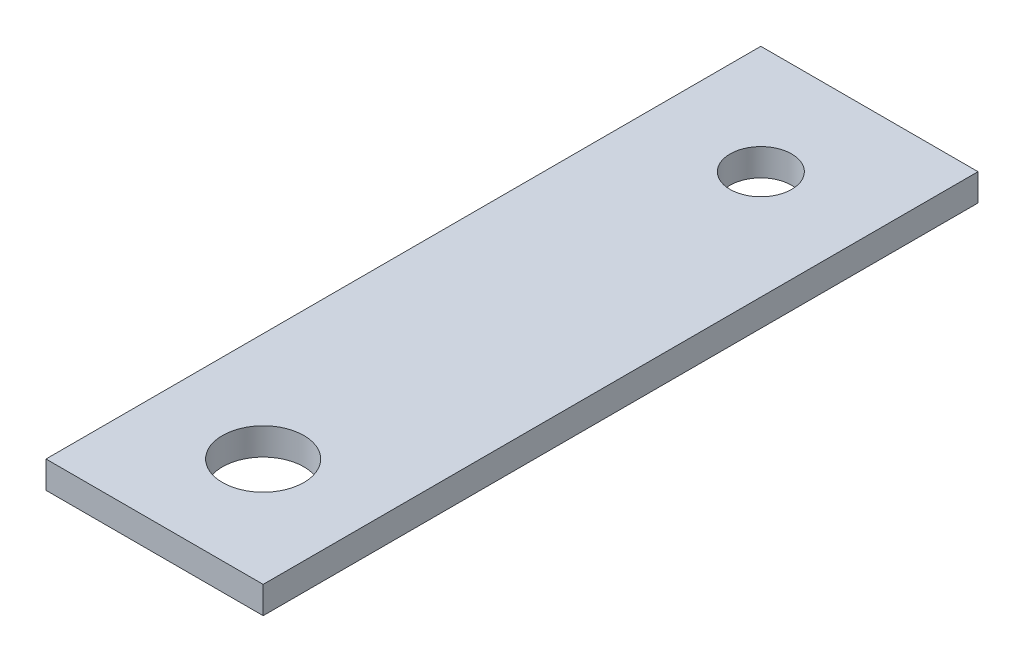
ISO-10303-21;
HEADER;
FILE_DESCRIPTION(('STEP AP214'),'2;1');
FILE_NAME('part.step','',(''),(''),'','','');
FILE_SCHEMA(('AUTOMOTIVE_DESIGN { 1 0 10303 214 1 1 1 1 }'));
ENDSEC;
DATA;
#1=APPLICATION_CONTEXT('core data for automotive mechanical design processes');
#2=APPLICATION_PROTOCOL_DEFINITION('international standard','automotive_design',2000,#1);
#3=PRODUCT_CONTEXT('',#1,'mechanical');
#4=PRODUCT('Part','Part','',(#3));
#5=PRODUCT_RELATED_PRODUCT_CATEGORY('part','',(#4));
#6=PRODUCT_DEFINITION_FORMATION('','',#4);
#7=PRODUCT_DEFINITION_CONTEXT('part definition',#1,'design');
#8=PRODUCT_DEFINITION('design','',#6,#7);
#9=PRODUCT_DEFINITION_SHAPE('','',#8);
#10=(LENGTH_UNIT() NAMED_UNIT(*) SI_UNIT(.MILLI.,.METRE.));
#11=(NAMED_UNIT(*) PLANE_ANGLE_UNIT() SI_UNIT($,.RADIAN.));
#12=(NAMED_UNIT(*) SI_UNIT($,.STERADIAN.) SOLID_ANGLE_UNIT());
#13=UNCERTAINTY_MEASURE_WITH_UNIT(LENGTH_MEASURE(1.E-05),#10,'distance_accuracy_value','');
#14=(GEOMETRIC_REPRESENTATION_CONTEXT(3) GLOBAL_UNCERTAINTY_ASSIGNED_CONTEXT((#13)) GLOBAL_UNIT_ASSIGNED_CONTEXT((#10,
#11,#12)) REPRESENTATION_CONTEXT('',''));
#15=CARTESIAN_POINT('',(0.,0.,0.));
#16=DIRECTION('',(0.,0.,1.));
#17=DIRECTION('',(1.,0.,0.));
#18=AXIS2_PLACEMENT_3D('',#15,#16,#17);
#19=CARTESIAN_POINT('',(-40.,-100.75,118.5));
#20=DIRECTION('',(0.,0.,1.));
#21=DIRECTION('',(1.,0.,0.));
#22=AXIS2_PLACEMENT_3D('',#19,#20,#21);
#23=PLANE('',#22);
#24=DIRECTION('',(-1.,0.,0.));
#25=VECTOR('',#24,1.);
#26=CARTESIAN_POINT('',(-40.,-101.5,118.5));
#27=LINE('',#26,#25);
#28=CARTESIAN_POINT('',(-34.,-101.5,118.5));
#29=VERTEX_POINT('',#28);
#30=CARTESIAN_POINT('',(-46.,-101.5,118.5));
#31=VERTEX_POINT('',#30);
#32=EDGE_CURVE('E10',#29,#31,#27,.T.);
#33=ORIENTED_EDGE('',*,*,#32,.F.);
#34=DIRECTION('',(0.,-1.,0.));
#35=VECTOR('',#34,1.);
#36=CARTESIAN_POINT('',(-34.,-100.75,118.5));
#37=LINE('',#36,#35);
#38=CARTESIAN_POINT('',(-34.,-100.,118.5));
#39=VERTEX_POINT('',#38);
#40=EDGE_CURVE('E62',#39,#29,#37,.T.);
#41=ORIENTED_EDGE('',*,*,#40,.F.);
#42=DIRECTION('',(1.,0.,0.));
#43=VECTOR('',#42,1.);
#44=CARTESIAN_POINT('',(-40.,-100.,118.5));
#45=LINE('',#44,#43);
#46=CARTESIAN_POINT('',(-46.,-100.,118.5));
#47=VERTEX_POINT('',#46);
#48=EDGE_CURVE('E90',#47,#39,#45,.T.);
#49=ORIENTED_EDGE('',*,*,#48,.F.);
#50=DIRECTION('',(0.,1.,0.));
#51=VECTOR('',#50,1.);
#52=CARTESIAN_POINT('',(-46.,-100.75,118.5));
#53=LINE('',#52,#51);
#54=EDGE_CURVE('E24',#31,#47,#53,.T.);
#55=ORIENTED_EDGE('',*,*,#54,.F.);
#56=EDGE_LOOP('',(#33,#41,#49,#55));
#57=FACE_BOUND('',#56,.T.);
#58=ADVANCED_FACE('F16',(#57),#23,.T.);
#59=CARTESIAN_POINT('',(-40.,-101.5,79.));
#60=DIRECTION('',(0.,-1.,0.));
#61=DIRECTION('',(0.,0.,-1.));
#62=AXIS2_PLACEMENT_3D('',#59,#60,#61);
#63=PLANE('',#62);
#64=CARTESIAN_POINT('',(-40.,-101.5,85.));
#65=DIRECTION('',(0.,-1.,0.));
#66=DIRECTION('',(0.,0.,-1.));
#67=AXIS2_PLACEMENT_3D('',#64,#65,#66);
#68=CIRCLE('',#67,1.7);
#69=CARTESIAN_POINT('',(-40.,-101.5,83.3));
#70=VERTEX_POINT('',#69);
#71=EDGE_CURVE('E94',#70,#70,#68,.T.);
#72=ORIENTED_EDGE('',*,*,#71,.F.);
#73=EDGE_LOOP('',(#72));
#74=FACE_BOUND('',#73,.T.);
#75=CARTESIAN_POINT('',(-40.,-101.5,112.5));
#76=DIRECTION('',(0.,-1.,0.));
#77=DIRECTION('',(0.,0.,-1.));
#78=AXIS2_PLACEMENT_3D('',#75,#76,#77);
#79=CIRCLE('',#78,2.25);
#80=CARTESIAN_POINT('',(-40.,-101.5,110.25));
#81=VERTEX_POINT('',#80);
#82=EDGE_CURVE('E73',#81,#81,#79,.T.);
#83=ORIENTED_EDGE('',*,*,#82,.F.);
#84=EDGE_LOOP('',(#83));
#85=FACE_BOUND('',#84,.T.);
#86=DIRECTION('',(0.,0.,1.));
#87=VECTOR('',#86,1.);
#88=CARTESIAN_POINT('',(-34.,-101.5,79.));
#89=LINE('',#88,#87);
#90=CARTESIAN_POINT('',(-34.,-101.5,79.));
#91=VERTEX_POINT('',#90);
#92=EDGE_CURVE('E55',#91,#29,#89,.T.);
#93=ORIENTED_EDGE('',*,*,#92,.T.);
#94=ORIENTED_EDGE('',*,*,#32,.T.);
#95=DIRECTION('',(0.,0.,1.));
#96=VECTOR('',#95,1.);
#97=CARTESIAN_POINT('',(-46.,-101.5,79.));
#98=LINE('',#97,#96);
#99=CARTESIAN_POINT('',(-46.,-101.5,79.));
#100=VERTEX_POINT('',#99);
#101=EDGE_CURVE('E68',#100,#31,#98,.T.);
#102=ORIENTED_EDGE('',*,*,#101,.F.);
#103=DIRECTION('',(1.,0.,0.));
#104=VECTOR('',#103,1.);
#105=CARTESIAN_POINT('',(-40.,-101.5,79.));
#106=LINE('',#105,#104);
#107=EDGE_CURVE('E66',#100,#91,#106,.T.);
#108=ORIENTED_EDGE('',*,*,#107,.T.);
#109=EDGE_LOOP('',(#93,#94,#102,#108));
#110=FACE_BOUND('',#109,.T.);
#111=ADVANCED_FACE('F67',(#74,#85,#110),#63,.T.);
#112=CARTESIAN_POINT('',(-46.,-100.75,79.));
#113=DIRECTION('',(-1.,0.,0.));
#114=DIRECTION('',(0.,0.,1.));
#115=AXIS2_PLACEMENT_3D('',#112,#113,#114);
#116=PLANE('',#115);
#117=ORIENTED_EDGE('',*,*,#101,.T.);
#118=ORIENTED_EDGE('',*,*,#54,.T.);
#119=DIRECTION('',(0.,0.,1.));
#120=VECTOR('',#119,1.);
#121=CARTESIAN_POINT('',(-46.,-100.,79.));
#122=LINE('',#121,#120);
#123=CARTESIAN_POINT('',(-46.,-100.,79.));
#124=VERTEX_POINT('',#123);
#125=EDGE_CURVE('E85',#124,#47,#122,.T.);
#126=ORIENTED_EDGE('',*,*,#125,.F.);
#127=DIRECTION('',(0.,-1.,0.));
#128=VECTOR('',#127,1.);
#129=CARTESIAN_POINT('',(-46.,-100.75,79.));
#130=LINE('',#129,#128);
#131=EDGE_CURVE('E72',#124,#100,#130,.T.);
#132=ORIENTED_EDGE('',*,*,#131,.T.);
#133=EDGE_LOOP('',(#117,#118,#126,#132));
#134=FACE_BOUND('',#133,.T.);
#135=ADVANCED_FACE('F110',(#134),#116,.T.);
#136=CARTESIAN_POINT('',(-40.,-100.,79.));
#137=DIRECTION('',(0.,1.,0.));
#138=DIRECTION('',(0.,0.,1.));
#139=AXIS2_PLACEMENT_3D('',#136,#137,#138);
#140=PLANE('',#139);
#141=CARTESIAN_POINT('',(-40.,-100.,85.));
#142=DIRECTION('',(0.,1.,0.));
#143=DIRECTION('',(0.,0.,1.));
#144=AXIS2_PLACEMENT_3D('',#141,#142,#143);
#145=CIRCLE('',#144,1.7);
#146=CARTESIAN_POINT('',(-40.,-100.,86.7));
#147=VERTEX_POINT('',#146);
#148=EDGE_CURVE('E19',#147,#147,#145,.T.);
#149=ORIENTED_EDGE('',*,*,#148,.F.);
#150=EDGE_LOOP('',(#149));
#151=FACE_BOUND('',#150,.T.);
#152=CARTESIAN_POINT('',(-40.,-100.,112.5));
#153=DIRECTION('',(0.,1.,0.));
#154=DIRECTION('',(0.,0.,1.));
#155=AXIS2_PLACEMENT_3D('',#152,#153,#154);
#156=CIRCLE('',#155,2.25);
#157=CARTESIAN_POINT('',(-40.,-100.,114.75));
#158=VERTEX_POINT('',#157);
#159=EDGE_CURVE('E92',#158,#158,#156,.T.);
#160=ORIENTED_EDGE('',*,*,#159,.F.);
#161=EDGE_LOOP('',(#160));
#162=FACE_BOUND('',#161,.T.);
#163=ORIENTED_EDGE('',*,*,#125,.T.);
#164=ORIENTED_EDGE('',*,*,#48,.T.);
#165=DIRECTION('',(0.,0.,1.));
#166=VECTOR('',#165,1.);
#167=CARTESIAN_POINT('',(-34.,-100.,79.));
#168=LINE('',#167,#166);
#169=CARTESIAN_POINT('',(-34.,-100.,79.));
#170=VERTEX_POINT('',#169);
#171=EDGE_CURVE('E63',#170,#39,#168,.T.);
#172=ORIENTED_EDGE('',*,*,#171,.F.);
#173=DIRECTION('',(-1.,0.,0.));
#174=VECTOR('',#173,1.);
#175=CARTESIAN_POINT('',(-40.,-100.,79.));
#176=LINE('',#175,#174);
#177=EDGE_CURVE('E78',#170,#124,#176,.T.);
#178=ORIENTED_EDGE('',*,*,#177,.T.);
#179=EDGE_LOOP('',(#163,#164,#172,#178));
#180=FACE_BOUND('',#179,.T.);
#181=ADVANCED_FACE('F107',(#151,#162,#180),#140,.T.);
#182=CARTESIAN_POINT('',(-40.,-100.75,79.));
#183=DIRECTION('',(0.,0.,-1.));
#184=DIRECTION('',(-1.,0.,0.));
#185=AXIS2_PLACEMENT_3D('',#182,#183,#184);
#186=PLANE('',#185);
#187=DIRECTION('',(0.,1.,0.));
#188=VECTOR('',#187,1.);
#189=CARTESIAN_POINT('',(-34.,-100.75,79.));
#190=LINE('',#189,#188);
#191=EDGE_CURVE('E60',#91,#170,#190,.T.);
#192=ORIENTED_EDGE('',*,*,#191,.F.);
#193=ORIENTED_EDGE('',*,*,#107,.F.);
#194=ORIENTED_EDGE('',*,*,#131,.F.);
#195=ORIENTED_EDGE('',*,*,#177,.F.);
#196=EDGE_LOOP('',(#192,#193,#194,#195));
#197=FACE_BOUND('',#196,.T.);
#198=ADVANCED_FACE('F76',(#197),#186,.T.);
#199=CARTESIAN_POINT('',(-34.,-100.75,79.));
#200=DIRECTION('',(1.,0.,0.));
#201=DIRECTION('',(0.,0.,-1.));
#202=AXIS2_PLACEMENT_3D('',#199,#200,#201);
#203=PLANE('',#202);
#204=ORIENTED_EDGE('',*,*,#191,.T.);
#205=ORIENTED_EDGE('',*,*,#171,.T.);
#206=ORIENTED_EDGE('',*,*,#40,.T.);
#207=ORIENTED_EDGE('',*,*,#92,.F.);
#208=EDGE_LOOP('',(#204,#205,#206,#207));
#209=FACE_BOUND('',#208,.T.);
#210=ADVANCED_FACE('F57',(#209),#203,.T.);
#211=CARTESIAN_POINT('',(-40.,-99.,112.5));
#212=DIRECTION('',(0.,-1.,0.));
#213=DIRECTION('',(0.,0.,-1.));
#214=AXIS2_PLACEMENT_3D('',#211,#212,#213);
#215=CYLINDRICAL_SURFACE('',#214,2.25);
#216=ORIENTED_EDGE('',*,*,#82,.T.);
#217=EDGE_LOOP('',(#216));
#218=FACE_BOUND('',#217,.T.);
#219=ORIENTED_EDGE('',*,*,#159,.T.);
#220=EDGE_LOOP('',(#219));
#221=FACE_BOUND('',#220,.T.);
#222=ADVANCED_FACE('F163',(#218,#221),#215,.F.);
#223=CARTESIAN_POINT('',(-40.,-99.,85.));
#224=DIRECTION('',(0.,-1.,0.));
#225=DIRECTION('',(0.,0.,-1.));
#226=AXIS2_PLACEMENT_3D('',#223,#224,#225);
#227=CYLINDRICAL_SURFACE('',#226,1.7);
#228=ORIENTED_EDGE('',*,*,#71,.T.);
#229=EDGE_LOOP('',(#228));
#230=FACE_BOUND('',#229,.T.);
#231=ORIENTED_EDGE('',*,*,#148,.T.);
#232=EDGE_LOOP('',(#231));
#233=FACE_BOUND('',#232,.T.);
#234=ADVANCED_FACE('F105',(#230,#233),#227,.F.);
#235=CLOSED_SHELL('',(#58,#111,#135,#181,#198,#210,#222,#234));
#236=MANIFOLD_SOLID_BREP('B1',#235);
#237=ADVANCED_BREP_SHAPE_REPRESENTATION('',(#18,#236),#14);
#238=SHAPE_DEFINITION_REPRESENTATION(#9,#237);
ENDSEC;
END-ISO-10303-21;
